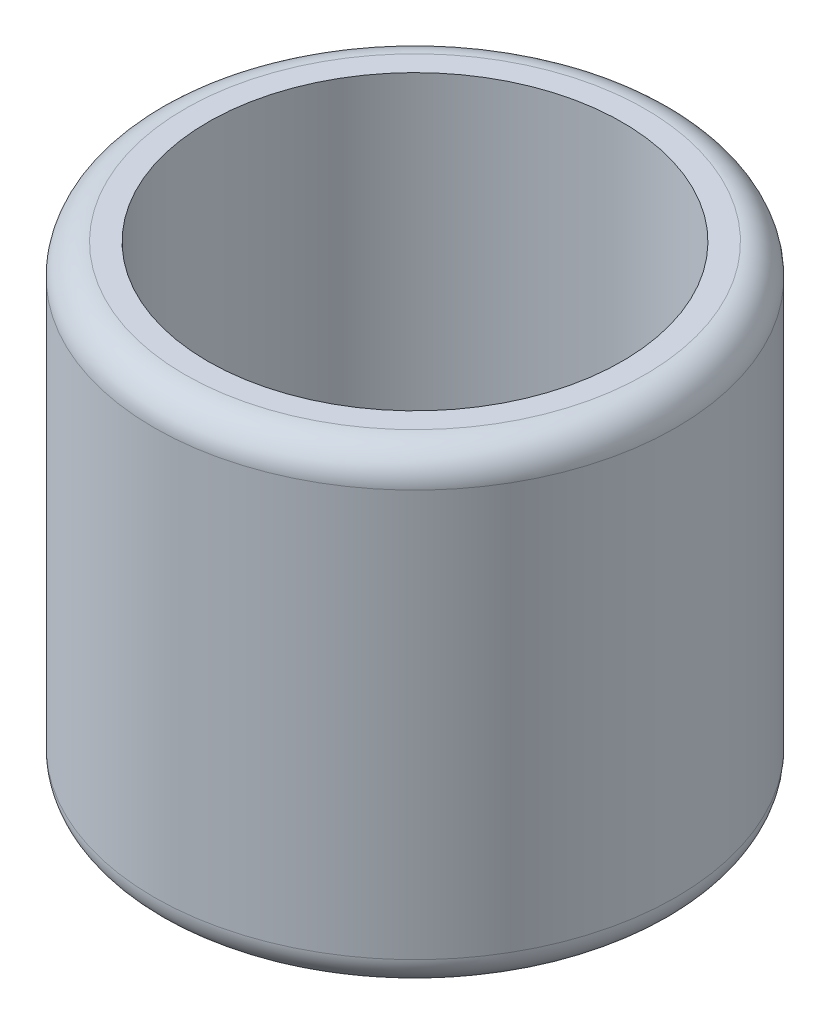
ISO-10303-21;
HEADER;
FILE_DESCRIPTION(('STEP AP214'),'2;1');
FILE_NAME('part.step','',(''),(''),'','','');
FILE_SCHEMA(('AUTOMOTIVE_DESIGN { 1 0 10303 214 1 1 1 1 }'));
ENDSEC;
DATA;
#1=APPLICATION_CONTEXT('core data for automotive mechanical design processes');
#2=APPLICATION_PROTOCOL_DEFINITION('international standard','automotive_design',2000,#1);
#3=PRODUCT_CONTEXT('',#1,'mechanical');
#4=PRODUCT('Part','Part','',(#3));
#5=PRODUCT_RELATED_PRODUCT_CATEGORY('part','',(#4));
#6=PRODUCT_DEFINITION_FORMATION('','',#4);
#7=PRODUCT_DEFINITION_CONTEXT('part definition',#1,'design');
#8=PRODUCT_DEFINITION('design','',#6,#7);
#9=PRODUCT_DEFINITION_SHAPE('','',#8);
#10=(LENGTH_UNIT() NAMED_UNIT(*) SI_UNIT(.MILLI.,.METRE.));
#11=(NAMED_UNIT(*) PLANE_ANGLE_UNIT() SI_UNIT($,.RADIAN.));
#12=(NAMED_UNIT(*) SI_UNIT($,.STERADIAN.) SOLID_ANGLE_UNIT());
#13=UNCERTAINTY_MEASURE_WITH_UNIT(LENGTH_MEASURE(1.E-05),#10,'distance_accuracy_value','');
#14=(GEOMETRIC_REPRESENTATION_CONTEXT(3) GLOBAL_UNCERTAINTY_ASSIGNED_CONTEXT((#13)) GLOBAL_UNIT_ASSIGNED_CONTEXT((#10,
#11,#12)) REPRESENTATION_CONTEXT('',''));
#15=CARTESIAN_POINT('',(0.,0.,0.));
#16=DIRECTION('',(0.,0.,1.));
#17=DIRECTION('',(1.,0.,0.));
#18=AXIS2_PLACEMENT_3D('',#15,#16,#17);
#19=CARTESIAN_POINT('',(0.,4.,0.));
#20=DIRECTION('',(0.,-1.,0.));
#21=DIRECTION('',(0.,0.,-1.));
#22=AXIS2_PLACEMENT_3D('',#19,#20,#21);
#23=CYLINDRICAL_SURFACE('',#22,17.);
#24=CARTESIAN_POINT('',(0.,28.5,0.));
#25=DIRECTION('',(0.,1.,0.));
#26=DIRECTION('',(0.,0.,1.));
#27=AXIS2_PLACEMENT_3D('',#24,#25,#26);
#28=CIRCLE('',#27,17.);
#29=CARTESIAN_POINT('',(0.,28.5,17.));
#30=VERTEX_POINT('',#29);
#31=EDGE_CURVE('E44',#30,#30,#28,.F.);
#32=ORIENTED_EDGE('',*,*,#31,.T.);
#33=EDGE_LOOP('',(#32));
#34=FACE_BOUND('',#33,.T.);
#35=CARTESIAN_POINT('',(0.,2.,0.));
#36=DIRECTION('',(0.,1.,0.));
#37=DIRECTION('',(0.,0.,1.));
#38=AXIS2_PLACEMENT_3D('',#35,#36,#37);
#39=CIRCLE('',#38,17.);
#40=CARTESIAN_POINT('',(0.,2.,17.));
#41=VERTEX_POINT('',#40);
#42=EDGE_CURVE('E48',#41,#41,#39,.T.);
#43=ORIENTED_EDGE('',*,*,#42,.T.);
#44=EDGE_LOOP('',(#43));
#45=FACE_BOUND('',#44,.T.);
#46=ADVANCED_FACE('F37',(#34,#45),#23,.T.);
#47=CARTESIAN_POINT('',(0.,0.,0.));
#48=DIRECTION('',(0.,1.,0.));
#49=DIRECTION('',(0.,0.,1.));
#50=AXIS2_PLACEMENT_3D('',#47,#48,#49);
#51=PLANE('',#50);
#52=CARTESIAN_POINT('',(0.,0.,0.));
#53=DIRECTION('',(0.,1.,0.));
#54=DIRECTION('',(0.,0.,1.));
#55=AXIS2_PLACEMENT_3D('',#52,#53,#54);
#56=CIRCLE('',#55,15.);
#57=CARTESIAN_POINT('',(0.,0.,15.));
#58=VERTEX_POINT('',#57);
#59=EDGE_CURVE('E11',#58,#58,#56,.F.);
#60=ORIENTED_EDGE('',*,*,#59,.T.);
#61=EDGE_LOOP('',(#60));
#62=FACE_BOUND('',#61,.T.);
#63=ADVANCED_FACE('F69',(#62),#51,.F.);
#64=CARTESIAN_POINT('',(0.,30.5,0.));
#65=DIRECTION('',(0.,1.,0.));
#66=DIRECTION('',(0.,0.,1.));
#67=AXIS2_PLACEMENT_3D('',#64,#65,#66);
#68=PLANE('',#67);
#69=CARTESIAN_POINT('',(0.,30.5,0.));
#70=DIRECTION('',(0.,1.,0.));
#71=DIRECTION('',(0.,0.,1.));
#72=AXIS2_PLACEMENT_3D('',#69,#70,#71);
#73=CIRCLE('',#72,15.);
#74=CARTESIAN_POINT('',(0.,30.5,15.));
#75=VERTEX_POINT('',#74);
#76=EDGE_CURVE('E52',#75,#75,#73,.T.);
#77=ORIENTED_EDGE('',*,*,#76,.T.);
#78=EDGE_LOOP('',(#77));
#79=FACE_BOUND('',#78,.T.);
#80=CARTESIAN_POINT('',(0.,30.5,0.));
#81=DIRECTION('',(0.,1.,0.));
#82=DIRECTION('',(0.,0.,1.));
#83=AXIS2_PLACEMENT_3D('',#80,#81,#82);
#84=CIRCLE('',#83,13.5);
#85=CARTESIAN_POINT('',(0.,30.5,13.5));
#86=VERTEX_POINT('',#85);
#87=EDGE_CURVE('E60',#86,#86,#84,.T.);
#88=ORIENTED_EDGE('',*,*,#87,.F.);
#89=EDGE_LOOP('',(#88));
#90=FACE_BOUND('',#89,.T.);
#91=ADVANCED_FACE('F67',(#79,#90),#68,.T.);
#92=CARTESIAN_POINT('',(0.,30.5,0.));
#93=DIRECTION('',(0.,-1.,0.));
#94=DIRECTION('',(0.,0.,-1.));
#95=AXIS2_PLACEMENT_3D('',#92,#93,#94);
#96=CYLINDRICAL_SURFACE('',#95,13.5);
#97=ORIENTED_EDGE('',*,*,#87,.T.);
#98=EDGE_LOOP('',(#97));
#99=FACE_BOUND('',#98,.T.);
#100=CARTESIAN_POINT('',(0.,4.,0.));
#101=DIRECTION('',(0.,1.,0.));
#102=DIRECTION('',(0.,0.,1.));
#103=AXIS2_PLACEMENT_3D('',#100,#101,#102);
#104=CIRCLE('',#103,13.5);
#105=CARTESIAN_POINT('',(0.,4.,13.5));
#106=VERTEX_POINT('',#105);
#107=EDGE_CURVE('E57',#106,#106,#104,.F.);
#108=ORIENTED_EDGE('',*,*,#107,.T.);
#109=EDGE_LOOP('',(#108));
#110=FACE_BOUND('',#109,.T.);
#111=ADVANCED_FACE('F64',(#99,#110),#96,.F.);
#112=CARTESIAN_POINT('',(0.,4.,0.));
#113=DIRECTION('',(0.,1.,0.));
#114=DIRECTION('',(0.,0.,1.));
#115=AXIS2_PLACEMENT_3D('',#112,#113,#114);
#116=PLANE('',#115);
#117=ORIENTED_EDGE('',*,*,#107,.F.);
#118=EDGE_LOOP('',(#117));
#119=FACE_BOUND('',#118,.T.);
#120=ADVANCED_FACE('F76',(#119),#116,.T.);
#121=CARTESIAN_POINT('',(0.,28.5,0.));
#122=DIRECTION('',(0.,1.,0.));
#123=DIRECTION('',(0.,0.,1.));
#124=AXIS2_PLACEMENT_3D('',#121,#122,#123);
#125=TOROIDAL_SURFACE('',#124,15.,2.);
#126=ORIENTED_EDGE('',*,*,#31,.F.);
#127=EDGE_LOOP('',(#126));
#128=FACE_BOUND('',#127,.T.);
#129=ORIENTED_EDGE('',*,*,#76,.F.);
#130=EDGE_LOOP('',(#129));
#131=FACE_BOUND('',#130,.T.);
#132=ADVANCED_FACE('F85',(#128,#131),#125,.T.);
#133=CARTESIAN_POINT('',(0.,2.,0.));
#134=DIRECTION('',(0.,1.,0.));
#135=DIRECTION('',(0.,0.,1.));
#136=AXIS2_PLACEMENT_3D('',#133,#134,#135);
#137=TOROIDAL_SURFACE('',#136,15.,2.);
#138=ORIENTED_EDGE('',*,*,#59,.F.);
#139=EDGE_LOOP('',(#138));
#140=FACE_BOUND('',#139,.T.);
#141=ORIENTED_EDGE('',*,*,#42,.F.);
#142=EDGE_LOOP('',(#141));
#143=FACE_BOUND('',#142,.T.);
#144=ADVANCED_FACE('F39',(#140,#143),#137,.T.);
#145=CLOSED_SHELL('',(#46,#63,#91,#111,#120,#132,#144));
#146=MANIFOLD_SOLID_BREP('B2',#145);
#147=ADVANCED_BREP_SHAPE_REPRESENTATION('',(#18,#146),#14);
#148=SHAPE_DEFINITION_REPRESENTATION(#9,#147);
ENDSEC;
END-ISO-10303-21;
